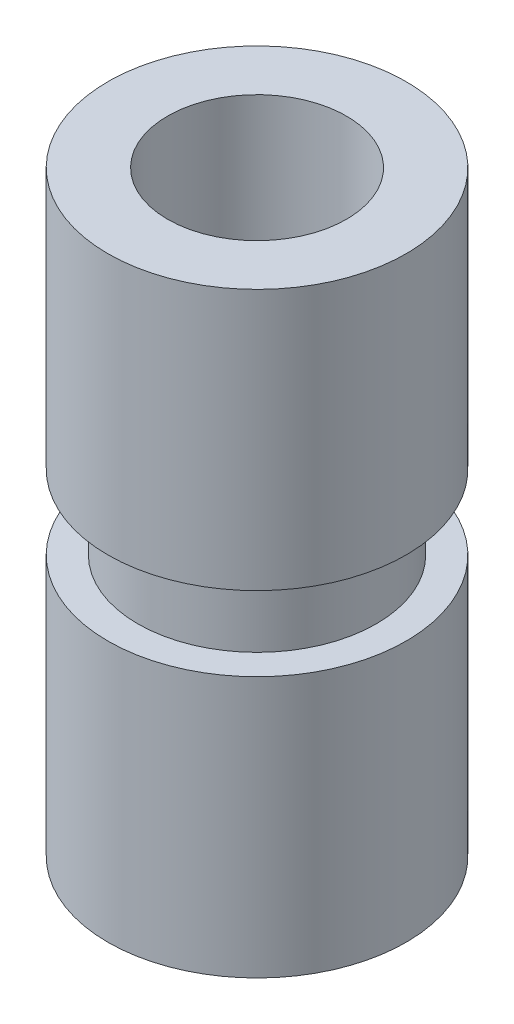
ISO-10303-21;
HEADER;
FILE_DESCRIPTION(('STEP AP214'),'2;1');
FILE_NAME('part.step','',(''),(''),'','','');
FILE_SCHEMA(('AUTOMOTIVE_DESIGN { 1 0 10303 214 1 1 1 1 }'));
ENDSEC;
DATA;
#1=APPLICATION_CONTEXT('core data for automotive mechanical design processes');
#2=APPLICATION_PROTOCOL_DEFINITION('international standard','automotive_design',2000,#1);
#3=PRODUCT_CONTEXT('',#1,'mechanical');
#4=PRODUCT('Part','Part','',(#3));
#5=PRODUCT_RELATED_PRODUCT_CATEGORY('part','',(#4));
#6=PRODUCT_DEFINITION_FORMATION('','',#4);
#7=PRODUCT_DEFINITION_CONTEXT('part definition',#1,'design');
#8=PRODUCT_DEFINITION('design','',#6,#7);
#9=PRODUCT_DEFINITION_SHAPE('','',#8);
#10=(LENGTH_UNIT() NAMED_UNIT(*) SI_UNIT(.MILLI.,.METRE.));
#11=(NAMED_UNIT(*) PLANE_ANGLE_UNIT() SI_UNIT($,.RADIAN.));
#12=(NAMED_UNIT(*) SI_UNIT($,.STERADIAN.) SOLID_ANGLE_UNIT());
#13=UNCERTAINTY_MEASURE_WITH_UNIT(LENGTH_MEASURE(1.E-05),#10,'distance_accuracy_value','');
#14=(GEOMETRIC_REPRESENTATION_CONTEXT(3) GLOBAL_UNCERTAINTY_ASSIGNED_CONTEXT((#13)) GLOBAL_UNIT_ASSIGNED_CONTEXT((#10,
#11,#12)) REPRESENTATION_CONTEXT('',''));
#15=CARTESIAN_POINT('',(0.,0.,0.));
#16=DIRECTION('',(0.,0.,1.));
#17=DIRECTION('',(1.,0.,0.));
#18=AXIS2_PLACEMENT_3D('',#15,#16,#17);
#19=CARTESIAN_POINT('',(0.,4.,0.));
#20=DIRECTION('',(0.,-1.,0.));
#21=DIRECTION('',(0.,0.,-1.));
#22=AXIS2_PLACEMENT_3D('',#19,#20,#21);
#23=CYLINDRICAL_SURFACE('',#22,1.);
#24=CARTESIAN_POINT('',(0.,2.25,0.));
#25=DIRECTION('',(0.,1.,0.));
#26=DIRECTION('',(0.,0.,1.));
#27=AXIS2_PLACEMENT_3D('',#24,#25,#26);
#28=CIRCLE('',#27,1.);
#29=CARTESIAN_POINT('',(0.,2.25,1.));
#30=VERTEX_POINT('',#29);
#31=EDGE_CURVE('E46',#30,#30,#28,.T.);
#32=ORIENTED_EDGE('',*,*,#31,.T.);
#33=EDGE_LOOP('',(#32));
#34=FACE_BOUND('',#33,.T.);
#35=CARTESIAN_POINT('',(0.,4.,0.));
#36=DIRECTION('',(0.,1.,0.));
#37=DIRECTION('',(0.,0.,1.));
#38=AXIS2_PLACEMENT_3D('',#35,#36,#37);
#39=CIRCLE('',#38,1.);
#40=CARTESIAN_POINT('',(0.,4.,1.));
#41=VERTEX_POINT('',#40);
#42=EDGE_CURVE('E11',#41,#41,#39,.T.);
#43=ORIENTED_EDGE('',*,*,#42,.F.);
#44=EDGE_LOOP('',(#43));
#45=FACE_BOUND('',#44,.T.);
#46=ADVANCED_FACE('F34',(#34,#45),#23,.T.);
#47=CARTESIAN_POINT('',(0.,4.,0.));
#48=DIRECTION('',(0.,1.,0.));
#49=DIRECTION('',(0.,0.,1.));
#50=AXIS2_PLACEMENT_3D('',#47,#48,#49);
#51=PLANE('',#50);
#52=CARTESIAN_POINT('',(0.,4.,0.));
#53=DIRECTION('',(0.,1.,0.));
#54=DIRECTION('',(0.,0.,1.));
#55=AXIS2_PLACEMENT_3D('',#52,#53,#54);
#56=CIRCLE('',#55,0.6);
#57=CARTESIAN_POINT('',(0.,4.,0.6));
#58=VERTEX_POINT('',#57);
#59=EDGE_CURVE('E104',#58,#58,#56,.T.);
#60=ORIENTED_EDGE('',*,*,#59,.F.);
#61=EDGE_LOOP('',(#60));
#62=FACE_BOUND('',#61,.T.);
#63=ORIENTED_EDGE('',*,*,#42,.T.);
#64=EDGE_LOOP('',(#63));
#65=FACE_BOUND('',#64,.T.);
#66=ADVANCED_FACE('F62',(#62,#65),#51,.T.);
#67=CARTESIAN_POINT('',(0.,2.25,0.));
#68=DIRECTION('',(0.,1.,0.));
#69=DIRECTION('',(0.,0.,1.));
#70=AXIS2_PLACEMENT_3D('',#67,#68,#69);
#71=PLANE('',#70);
#72=CARTESIAN_POINT('',(0.,2.25,0.));
#73=DIRECTION('',(0.,1.,0.));
#74=DIRECTION('',(0.,0.,1.));
#75=AXIS2_PLACEMENT_3D('',#72,#73,#74);
#76=CIRCLE('',#75,0.8);
#77=CARTESIAN_POINT('',(0.,2.25,0.8));
#78=VERTEX_POINT('',#77);
#79=EDGE_CURVE('E49',#78,#78,#76,.T.);
#80=ORIENTED_EDGE('',*,*,#79,.T.);
#81=EDGE_LOOP('',(#80));
#82=FACE_BOUND('',#81,.T.);
#83=ORIENTED_EDGE('',*,*,#31,.F.);
#84=EDGE_LOOP('',(#83));
#85=FACE_BOUND('',#84,.T.);
#86=ADVANCED_FACE('F59',(#82,#85),#71,.F.);
#87=CARTESIAN_POINT('',(0.,1.75,0.));
#88=DIRECTION('',(0.,1.,0.));
#89=DIRECTION('',(0.,0.,1.));
#90=AXIS2_PLACEMENT_3D('',#87,#88,#89);
#91=PLANE('',#90);
#92=CARTESIAN_POINT('',(0.,1.75,0.));
#93=DIRECTION('',(0.,1.,0.));
#94=DIRECTION('',(0.,0.,1.));
#95=AXIS2_PLACEMENT_3D('',#92,#93,#94);
#96=CIRCLE('',#95,0.8);
#97=CARTESIAN_POINT('',(0.,1.75,0.8));
#98=VERTEX_POINT('',#97);
#99=EDGE_CURVE('E103',#98,#98,#96,.T.);
#100=ORIENTED_EDGE('',*,*,#99,.F.);
#101=EDGE_LOOP('',(#100));
#102=FACE_BOUND('',#101,.T.);
#103=CARTESIAN_POINT('',(0.,1.75,0.));
#104=DIRECTION('',(0.,1.,0.));
#105=DIRECTION('',(0.,0.,1.));
#106=AXIS2_PLACEMENT_3D('',#103,#104,#105);
#107=CIRCLE('',#106,1.);
#108=CARTESIAN_POINT('',(0.,1.75,1.));
#109=VERTEX_POINT('',#108);
#110=EDGE_CURVE('E52',#109,#109,#107,.T.);
#111=ORIENTED_EDGE('',*,*,#110,.T.);
#112=EDGE_LOOP('',(#111));
#113=FACE_BOUND('',#112,.T.);
#114=ADVANCED_FACE('F61',(#102,#113),#91,.T.);
#115=CARTESIAN_POINT('',(0.,2.25,0.));
#116=DIRECTION('',(0.,-1.,0.));
#117=DIRECTION('',(0.,0.,-1.));
#118=AXIS2_PLACEMENT_3D('',#115,#116,#117);
#119=CYLINDRICAL_SURFACE('',#118,0.8);
#120=ORIENTED_EDGE('',*,*,#79,.F.);
#121=EDGE_LOOP('',(#120));
#122=FACE_BOUND('',#121,.T.);
#123=ORIENTED_EDGE('',*,*,#99,.T.);
#124=EDGE_LOOP('',(#123));
#125=FACE_BOUND('',#124,.T.);
#126=ADVANCED_FACE('F69',(#122,#125),#119,.T.);
#127=CARTESIAN_POINT('',(0.,0.,0.));
#128=DIRECTION('',(0.,1.,0.));
#129=DIRECTION('',(0.,0.,1.));
#130=AXIS2_PLACEMENT_3D('',#127,#128,#129);
#131=PLANE('',#130);
#132=CARTESIAN_POINT('',(0.,0.,0.));
#133=DIRECTION('',(0.,1.,0.));
#134=DIRECTION('',(0.,0.,1.));
#135=AXIS2_PLACEMENT_3D('',#132,#133,#134);
#136=CIRCLE('',#135,0.6);
#137=CARTESIAN_POINT('',(0.,0.,0.6));
#138=VERTEX_POINT('',#137);
#139=EDGE_CURVE('E37',#138,#138,#136,.T.);
#140=ORIENTED_EDGE('',*,*,#139,.T.);
#141=EDGE_LOOP('',(#140));
#142=FACE_BOUND('',#141,.T.);
#143=CARTESIAN_POINT('',(0.,0.,0.));
#144=DIRECTION('',(0.,1.,0.));
#145=DIRECTION('',(0.,0.,1.));
#146=AXIS2_PLACEMENT_3D('',#143,#144,#145);
#147=CIRCLE('',#146,1.);
#148=CARTESIAN_POINT('',(0.,0.,1.));
#149=VERTEX_POINT('',#148);
#150=EDGE_CURVE('E41',#149,#149,#147,.T.);
#151=ORIENTED_EDGE('',*,*,#150,.F.);
#152=EDGE_LOOP('',(#151));
#153=FACE_BOUND('',#152,.T.);
#154=ADVANCED_FACE('F82',(#142,#153),#131,.F.);
#155=ORIENTED_EDGE('',*,*,#150,.T.);
#156=EDGE_LOOP('',(#155));
#157=FACE_BOUND('',#156,.T.);
#158=ORIENTED_EDGE('',*,*,#110,.F.);
#159=EDGE_LOOP('',(#158));
#160=FACE_BOUND('',#159,.T.);
#161=ADVANCED_FACE('F77',(#157,#160),#23,.T.);
#162=CARTESIAN_POINT('',(0.,-3.5,0.));
#163=DIRECTION('',(0.,1.,0.));
#164=DIRECTION('',(0.,0.,1.));
#165=AXIS2_PLACEMENT_3D('',#162,#163,#164);
#166=CYLINDRICAL_SURFACE('',#165,0.6);
#167=ORIENTED_EDGE('',*,*,#59,.T.);
#168=EDGE_LOOP('',(#167));
#169=FACE_BOUND('',#168,.T.);
#170=ORIENTED_EDGE('',*,*,#139,.F.);
#171=EDGE_LOOP('',(#170));
#172=FACE_BOUND('',#171,.T.);
#173=ADVANCED_FACE('F81',(#169,#172),#166,.F.);
#174=CLOSED_SHELL('',(#46,#66,#86,#114,#126,#154,#161,#173));
#175=MANIFOLD_SOLID_BREP('B2',#174);
#176=ADVANCED_BREP_SHAPE_REPRESENTATION('',(#18,#175),#14);
#177=SHAPE_DEFINITION_REPRESENTATION(#9,#176);
ENDSEC;
END-ISO-10303-21;
